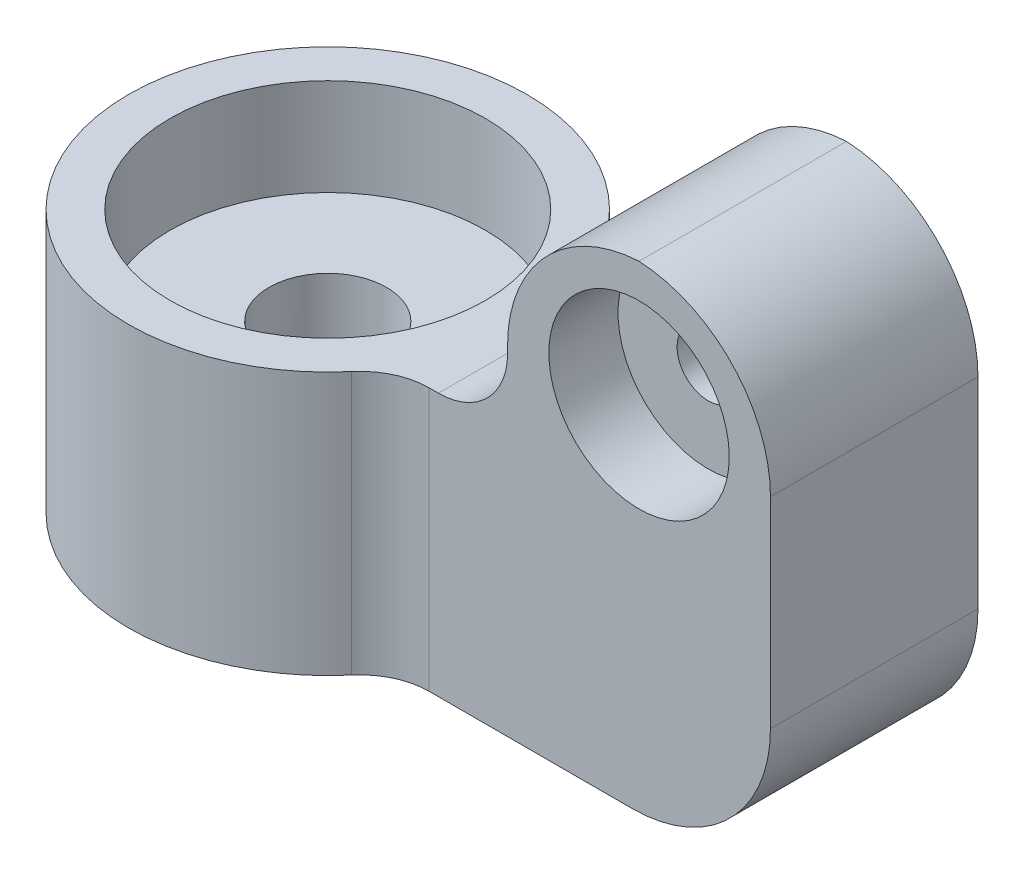
ISO-10303-21;
HEADER;
FILE_DESCRIPTION(('STEP AP214'),'2;1');
FILE_NAME('part.step','',(''),(''),'','','');
FILE_SCHEMA(('AUTOMOTIVE_DESIGN { 1 0 10303 214 1 1 1 1 }'));
ENDSEC;
DATA;
#1=APPLICATION_CONTEXT('core data for automotive mechanical design processes');
#2=APPLICATION_PROTOCOL_DEFINITION('international standard','automotive_design',2000,#1);
#3=PRODUCT_CONTEXT('',#1,'mechanical');
#4=PRODUCT('Part','Part','',(#3));
#5=PRODUCT_RELATED_PRODUCT_CATEGORY('part','',(#4));
#6=PRODUCT_DEFINITION_FORMATION('','',#4);
#7=PRODUCT_DEFINITION_CONTEXT('part definition',#1,'design');
#8=PRODUCT_DEFINITION('design','',#6,#7);
#9=PRODUCT_DEFINITION_SHAPE('','',#8);
#10=(LENGTH_UNIT() NAMED_UNIT(*) SI_UNIT(.MILLI.,.METRE.));
#11=(NAMED_UNIT(*) PLANE_ANGLE_UNIT() SI_UNIT($,.RADIAN.));
#12=(NAMED_UNIT(*) SI_UNIT($,.STERADIAN.) SOLID_ANGLE_UNIT());
#13=UNCERTAINTY_MEASURE_WITH_UNIT(LENGTH_MEASURE(1.E-05),#10,'distance_accuracy_value','');
#14=(GEOMETRIC_REPRESENTATION_CONTEXT(3) GLOBAL_UNCERTAINTY_ASSIGNED_CONTEXT((#13)) GLOBAL_UNIT_ASSIGNED_CONTEXT((#10,
#11,#12)) REPRESENTATION_CONTEXT('',''));
#15=CARTESIAN_POINT('',(0.,0.,0.));
#16=DIRECTION('',(0.,0.,1.));
#17=DIRECTION('',(1.,0.,0.));
#18=AXIS2_PLACEMENT_3D('',#15,#16,#17);
#19=CARTESIAN_POINT('',(-30.,-25.52,0.));
#20=DIRECTION('',(0.,1.,0.));
#21=DIRECTION('',(0.,0.,1.));
#22=AXIS2_PLACEMENT_3D('',#19,#20,#21);
#23=CYLINDRICAL_SURFACE('',#22,4.25);
#24=CARTESIAN_POINT('',(-30.,-13.52,0.));
#25=DIRECTION('',(0.,1.,0.));
#26=DIRECTION('',(0.,0.,1.));
#27=AXIS2_PLACEMENT_3D('',#24,#25,#26);
#28=CIRCLE('',#27,4.25);
#29=CARTESIAN_POINT('',(-30.,-13.52,4.25));
#30=VERTEX_POINT('',#29);
#31=EDGE_CURVE('E547',#30,#30,#28,.T.);
#32=ORIENTED_EDGE('',*,*,#31,.T.);
#33=EDGE_LOOP('',(#32));
#34=FACE_BOUND('',#33,.T.);
#35=CARTESIAN_POINT('',(-30.,-18.52,0.));
#36=DIRECTION('',(0.,-1.,0.));
#37=DIRECTION('',(1.,0.,0.));
#38=AXIS2_PLACEMENT_3D('',#35,#36,#37);
#39=CIRCLE('',#38,4.25);
#40=CARTESIAN_POINT('',(-25.75,-18.52,0.));
#41=VERTEX_POINT('',#40);
#42=EDGE_CURVE('E172',#41,#41,#39,.F.);
#43=ORIENTED_EDGE('',*,*,#42,.F.);
#44=EDGE_LOOP('',(#43));
#45=FACE_BOUND('',#44,.T.);
#46=ADVANCED_FACE('F45',(#34,#45),#23,.F.);
#47=CARTESIAN_POINT('',(0.,0.,7.5));
#48=DIRECTION('',(0.,0.,-1.));
#49=DIRECTION('',(-1.,0.,0.));
#50=AXIS2_PLACEMENT_3D('',#47,#48,#49);
#51=CYLINDRICAL_SURFACE('',#50,2.25);
#52=CARTESIAN_POINT('',(0.,0.,-2.5));
#53=DIRECTION('',(0.,0.,1.));
#54=DIRECTION('',(1.,0.,0.));
#55=AXIS2_PLACEMENT_3D('',#52,#53,#54);
#56=CIRCLE('',#55,2.25);
#57=CARTESIAN_POINT('',(2.25,0.,-2.5));
#58=VERTEX_POINT('',#57);
#59=EDGE_CURVE('E280',#58,#58,#56,.T.);
#60=ORIENTED_EDGE('',*,*,#59,.F.);
#61=EDGE_LOOP('',(#60));
#62=FACE_BOUND('',#61,.T.);
#63=CARTESIAN_POINT('',(0.,0.,2.5));
#64=DIRECTION('',(0.,0.,1.));
#65=DIRECTION('',(1.,0.,0.));
#66=AXIS2_PLACEMENT_3D('',#63,#64,#65);
#67=CIRCLE('',#66,2.25);
#68=CARTESIAN_POINT('',(2.25,0.,2.5));
#69=VERTEX_POINT('',#68);
#70=EDGE_CURVE('E273',#69,#69,#67,.T.);
#71=ORIENTED_EDGE('',*,*,#70,.T.);
#72=EDGE_LOOP('',(#71));
#73=FACE_BOUND('',#72,.T.);
#74=ADVANCED_FACE('F321',(#62,#73),#51,.F.);
#75=CARTESIAN_POINT('',(0.,-6.52,7.5));
#76=DIRECTION('',(0.,1.,0.));
#77=DIRECTION('',(0.,0.,1.));
#78=AXIS2_PLACEMENT_3D('',#75,#76,#77);
#79=PLANE('',#78);
#80=CARTESIAN_POINT('',(-30.,-6.52,0.));
#81=DIRECTION('',(0.,1.,0.));
#82=DIRECTION('',(0.,0.,1.));
#83=AXIS2_PLACEMENT_3D('',#80,#81,#82);
#84=CIRCLE('',#83,11.4);
#85=CARTESIAN_POINT('',(-30.,-6.52,11.4));
#86=VERTEX_POINT('',#85);
#87=EDGE_CURVE('E543',#86,#86,#84,.T.);
#88=ORIENTED_EDGE('',*,*,#87,.F.);
#89=EDGE_LOOP('',(#88));
#90=FACE_BOUND('',#89,.T.);
#91=DIRECTION('',(1.,0.,0.));
#92=VECTOR('',#91,1.);
#93=CARTESIAN_POINT('',(0.,-6.52,7.5));
#94=LINE('',#93,#92);
#95=CARTESIAN_POINT('',(-15.1638953899617,-6.52,7.5));
#96=VERTEX_POINT('',#95);
#97=CARTESIAN_POINT('',(-14.5,-6.52,7.5));
#98=VERTEX_POINT('',#97);
#99=EDGE_CURVE('E257',#96,#98,#94,.T.);
#100=ORIENTED_EDGE('',*,*,#99,.T.);
#101=DIRECTION('',(0.,0.,-1.));
#102=VECTOR('',#101,1.);
#103=CARTESIAN_POINT('',(-14.5,-6.52,-7.5));
#104=LINE('',#103,#102);
#105=CARTESIAN_POINT('',(-14.5,-6.52,-7.5));
#106=VERTEX_POINT('',#105);
#107=EDGE_CURVE('E177',#98,#106,#104,.T.);
#108=ORIENTED_EDGE('',*,*,#107,.T.);
#109=DIRECTION('',(1.,0.,0.));
#110=VECTOR('',#109,1.);
#111=CARTESIAN_POINT('',(0.,-6.52,-7.5));
#112=LINE('',#111,#110);
#113=CARTESIAN_POINT('',(-15.1638953899617,-6.52,-7.5));
#114=VERTEX_POINT('',#113);
#115=EDGE_CURVE('E144',#114,#106,#112,.T.);
#116=ORIENTED_EDGE('',*,*,#115,.F.);
#117=CARTESIAN_POINT('',(-15.1638953899617,-6.52,-12.5));
#118=DIRECTION('',(0.,1.,0.));
#119=DIRECTION('',(0.,0.,1.));
#120=AXIS2_PLACEMENT_3D('',#117,#118,#119);
#121=CIRCLE('',#120,5.);
#122=CARTESIAN_POINT('',(-18.987633691518,-6.52,-9.27835051546392));
#123=VERTEX_POINT('',#122);
#124=EDGE_CURVE('E156',#114,#123,#121,.F.);
#125=ORIENTED_EDGE('',*,*,#124,.T.);
#126=CARTESIAN_POINT('',(-30.,-6.52,0.));
#127=DIRECTION('',(0.,1.,0.));
#128=DIRECTION('',(0.,0.,1.));
#129=AXIS2_PLACEMENT_3D('',#126,#127,#128);
#130=CIRCLE('',#129,14.4);
#131=CARTESIAN_POINT('',(-18.987633691518,-6.52,9.27835051546392));
#132=VERTEX_POINT('',#131);
#133=EDGE_CURVE('E298',#123,#132,#130,.T.);
#134=ORIENTED_EDGE('',*,*,#133,.T.);
#135=CARTESIAN_POINT('',(-15.1638953899617,-6.52,12.5));
#136=DIRECTION('',(0.,1.,0.));
#137=DIRECTION('',(0.,0.,1.));
#138=AXIS2_PLACEMENT_3D('',#135,#136,#137);
#139=CIRCLE('',#138,5.);
#140=EDGE_CURVE('E195',#132,#96,#139,.F.);
#141=ORIENTED_EDGE('',*,*,#140,.T.);
#142=EDGE_LOOP('',(#100,#108,#116,#125,#134,#141));
#143=FACE_BOUND('',#142,.T.);
#144=ADVANCED_FACE('F260',(#90,#143),#79,.T.);
#145=CARTESIAN_POINT('',(0.,-25.52,7.5));
#146=DIRECTION('',(0.,-1.,0.));
#147=DIRECTION('',(1.,0.,0.));
#148=AXIS2_PLACEMENT_3D('',#145,#146,#147);
#149=PLANE('',#148);
#150=CARTESIAN_POINT('',(-30.,-25.52,0.));
#151=DIRECTION('',(0.,-1.,0.));
#152=DIRECTION('',(1.,0.,0.));
#153=AXIS2_PLACEMENT_3D('',#150,#151,#152);
#154=CIRCLE('',#153,11.4);
#155=CARTESIAN_POINT('',(-18.6,-25.52,0.));
#156=VERTEX_POINT('',#155);
#157=EDGE_CURVE('E242',#156,#156,#154,.T.);
#158=ORIENTED_EDGE('',*,*,#157,.F.);
#159=EDGE_LOOP('',(#158));
#160=FACE_BOUND('',#159,.T.);
#161=DIRECTION('',(-1.,0.,0.));
#162=VECTOR('',#161,1.);
#163=CARTESIAN_POINT('',(0.,-25.52,-7.5));
#164=LINE('',#163,#162);
#165=CARTESIAN_POINT('',(-0.499999999999996,-25.52,-7.5));
#166=VERTEX_POINT('',#165);
#167=CARTESIAN_POINT('',(-15.1638953899617,-25.52,-7.5));
#168=VERTEX_POINT('',#167);
#169=EDGE_CURVE('E130',#166,#168,#164,.T.);
#170=ORIENTED_EDGE('',*,*,#169,.F.);
#171=DIRECTION('',(0.,0.,-1.));
#172=VECTOR('',#171,1.);
#173=CARTESIAN_POINT('',(-0.499999999999996,-25.52,7.5));
#174=LINE('',#173,#172);
#175=CARTESIAN_POINT('',(-0.499999999999996,-25.52,7.5));
#176=VERTEX_POINT('',#175);
#177=EDGE_CURVE('E12',#166,#176,#174,.F.);
#178=ORIENTED_EDGE('',*,*,#177,.T.);
#179=DIRECTION('',(-1.,0.,0.));
#180=VECTOR('',#179,1.);
#181=CARTESIAN_POINT('',(0.,-25.52,7.5));
#182=LINE('',#181,#180);
#183=CARTESIAN_POINT('',(-15.1638953899617,-25.52,7.5));
#184=VERTEX_POINT('',#183);
#185=EDGE_CURVE('E235',#176,#184,#182,.T.);
#186=ORIENTED_EDGE('',*,*,#185,.T.);
#187=CARTESIAN_POINT('',(-15.1638953899617,-25.52,12.5));
#188=DIRECTION('',(0.,-1.,0.));
#189=DIRECTION('',(1.,0.,0.));
#190=AXIS2_PLACEMENT_3D('',#187,#188,#189);
#191=CIRCLE('',#190,5.);
#192=CARTESIAN_POINT('',(-18.987633691518,-25.52,9.27835051546392));
#193=VERTEX_POINT('',#192);
#194=EDGE_CURVE('E198',#184,#193,#191,.F.);
#195=ORIENTED_EDGE('',*,*,#194,.T.);
#196=CARTESIAN_POINT('',(-30.,-25.52,0.));
#197=DIRECTION('',(0.,1.,0.));
#198=DIRECTION('',(0.,0.,1.));
#199=AXIS2_PLACEMENT_3D('',#196,#197,#198);
#200=CIRCLE('',#199,14.4);
#201=CARTESIAN_POINT('',(-18.987633691518,-25.52,-9.27835051546392));
#202=VERTEX_POINT('',#201);
#203=EDGE_CURVE('E151',#202,#193,#200,.T.);
#204=ORIENTED_EDGE('',*,*,#203,.F.);
#205=CARTESIAN_POINT('',(-15.1638953899617,-25.52,-12.5));
#206=DIRECTION('',(0.,-1.,0.));
#207=DIRECTION('',(1.,0.,0.));
#208=AXIS2_PLACEMENT_3D('',#205,#206,#207);
#209=CIRCLE('',#208,5.);
#210=EDGE_CURVE('E148',#202,#168,#209,.F.);
#211=ORIENTED_EDGE('',*,*,#210,.T.);
#212=EDGE_LOOP('',(#170,#178,#186,#195,#204,#211));
#213=FACE_BOUND('',#212,.T.);
#214=ADVANCED_FACE('F149',(#160,#213),#149,.T.);
#215=CARTESIAN_POINT('',(9.5,0.,7.5));
#216=DIRECTION('',(1.,0.,0.));
#217=DIRECTION('',(0.,1.,0.));
#218=AXIS2_PLACEMENT_3D('',#215,#216,#217);
#219=PLANE('',#218);
#220=DIRECTION('',(0.,-1.,0.));
#221=VECTOR('',#220,1.);
#222=CARTESIAN_POINT('',(9.5,0.,-7.5));
#223=LINE('',#222,#221);
#224=CARTESIAN_POINT('',(9.5,-1.,-7.5));
#225=VERTEX_POINT('',#224);
#226=CARTESIAN_POINT('',(9.5,-15.52,-7.5));
#227=VERTEX_POINT('',#226);
#228=EDGE_CURVE('E143',#225,#227,#223,.T.);
#229=ORIENTED_EDGE('',*,*,#228,.F.);
#230=DIRECTION('',(0.,0.,-1.));
#231=VECTOR('',#230,1.);
#232=CARTESIAN_POINT('',(9.5,-1.,7.5));
#233=LINE('',#232,#231);
#234=CARTESIAN_POINT('',(9.5,-1.,7.5));
#235=VERTEX_POINT('',#234);
#236=EDGE_CURVE('E55',#225,#235,#233,.F.);
#237=ORIENTED_EDGE('',*,*,#236,.T.);
#238=DIRECTION('',(0.,-1.,0.));
#239=VECTOR('',#238,1.);
#240=CARTESIAN_POINT('',(9.5,0.,7.5));
#241=LINE('',#240,#239);
#242=CARTESIAN_POINT('',(9.5,-15.52,7.5));
#243=VERTEX_POINT('',#242);
#244=EDGE_CURVE('E169',#235,#243,#241,.T.);
#245=ORIENTED_EDGE('',*,*,#244,.T.);
#246=DIRECTION('',(0.,0.,-1.));
#247=VECTOR('',#246,1.);
#248=CARTESIAN_POINT('',(9.5,-15.52,7.5));
#249=LINE('',#248,#247);
#250=EDGE_CURVE('E220',#243,#227,#249,.T.);
#251=ORIENTED_EDGE('',*,*,#250,.T.);
#252=EDGE_LOOP('',(#229,#237,#245,#251));
#253=FACE_BOUND('',#252,.T.);
#254=ADVANCED_FACE('F228',(#253),#219,.T.);
#255=CARTESIAN_POINT('',(-9.5,0.,7.5));
#256=DIRECTION('',(-1.,0.,0.));
#257=DIRECTION('',(0.,0.,1.));
#258=AXIS2_PLACEMENT_3D('',#255,#256,#257);
#259=PLANE('',#258);
#260=DIRECTION('',(0.,1.,0.));
#261=VECTOR('',#260,1.);
#262=CARTESIAN_POINT('',(-9.5,0.,7.5));
#263=LINE('',#262,#261);
#264=CARTESIAN_POINT('',(-9.5,-1.52,7.5));
#265=VERTEX_POINT('',#264);
#266=CARTESIAN_POINT('',(-9.5,-1.,7.5));
#267=VERTEX_POINT('',#266);
#268=EDGE_CURVE('E161',#265,#267,#263,.T.);
#269=ORIENTED_EDGE('',*,*,#268,.T.);
#270=DIRECTION('',(0.,0.,-1.));
#271=VECTOR('',#270,1.);
#272=CARTESIAN_POINT('',(-9.5,-1.,7.5));
#273=LINE('',#272,#271);
#274=CARTESIAN_POINT('',(-9.5,-1.,-7.5));
#275=VERTEX_POINT('',#274);
#276=EDGE_CURVE('E201',#267,#275,#273,.T.);
#277=ORIENTED_EDGE('',*,*,#276,.T.);
#278=DIRECTION('',(0.,1.,0.));
#279=VECTOR('',#278,1.);
#280=CARTESIAN_POINT('',(-9.5,0.,-7.5));
#281=LINE('',#280,#279);
#282=CARTESIAN_POINT('',(-9.5,-1.52,-7.5));
#283=VERTEX_POINT('',#282);
#284=EDGE_CURVE('E251',#283,#275,#281,.T.);
#285=ORIENTED_EDGE('',*,*,#284,.F.);
#286=DIRECTION('',(0.,0.,-1.));
#287=VECTOR('',#286,1.);
#288=CARTESIAN_POINT('',(-9.5,-1.52,7.5));
#289=LINE('',#288,#287);
#290=EDGE_CURVE('E181',#283,#265,#289,.F.);
#291=ORIENTED_EDGE('',*,*,#290,.T.);
#292=EDGE_LOOP('',(#269,#277,#285,#291));
#293=FACE_BOUND('',#292,.T.);
#294=ADVANCED_FACE('F248',(#293),#259,.T.);
#295=CARTESIAN_POINT('',(0.,0.,7.5));
#296=DIRECTION('',(0.,0.,1.));
#297=DIRECTION('',(1.,0.,0.));
#298=AXIS2_PLACEMENT_3D('',#295,#296,#297);
#299=PLANE('',#298);
#300=CARTESIAN_POINT('',(-0.499999999999999,-1.,7.5));
#301=DIRECTION('',(0.,0.,1.));
#302=DIRECTION('',(1.,0.,0.));
#303=AXIS2_PLACEMENT_3D('',#300,#301,#302);
#304=CIRCLE('',#303,10.);
#305=CARTESIAN_POINT('',(0.,8.98749217771909,7.5));
#306=VERTEX_POINT('',#305);
#307=EDGE_CURVE('E62',#235,#306,#304,.T.);
#308=ORIENTED_EDGE('',*,*,#307,.T.);
#309=CARTESIAN_POINT('',(0.5,-1.,7.5));
#310=DIRECTION('',(0.,0.,1.));
#311=DIRECTION('',(1.,0.,0.));
#312=AXIS2_PLACEMENT_3D('',#309,#310,#311);
#313=CIRCLE('',#312,10.);
#314=EDGE_CURVE('E217',#306,#267,#313,.T.);
#315=ORIENTED_EDGE('',*,*,#314,.T.);
#316=ORIENTED_EDGE('',*,*,#268,.F.);
#317=CARTESIAN_POINT('',(-14.5,-1.52,7.5));
#318=DIRECTION('',(0.,0.,1.));
#319=DIRECTION('',(1.,0.,0.));
#320=AXIS2_PLACEMENT_3D('',#317,#318,#319);
#321=CIRCLE('',#320,5.);
#322=EDGE_CURVE('E192',#265,#98,#321,.F.);
#323=ORIENTED_EDGE('',*,*,#322,.T.);
#324=ORIENTED_EDGE('',*,*,#99,.F.);
#325=DIRECTION('',(0.,-1.,0.));
#326=VECTOR('',#325,1.);
#327=CARTESIAN_POINT('',(-15.1638953899617,-25.52,7.5));
#328=LINE('',#327,#326);
#329=EDGE_CURVE('E184',#96,#184,#328,.T.);
#330=ORIENTED_EDGE('',*,*,#329,.T.);
#331=ORIENTED_EDGE('',*,*,#185,.F.);
#332=CARTESIAN_POINT('',(-0.499999999999997,-15.52,7.5));
#333=DIRECTION('',(0.,0.,1.));
#334=DIRECTION('',(1.,0.,0.));
#335=AXIS2_PLACEMENT_3D('',#332,#333,#334);
#336=CIRCLE('',#335,10.);
#337=EDGE_CURVE('E68',#176,#243,#336,.T.);
#338=ORIENTED_EDGE('',*,*,#337,.T.);
#339=ORIENTED_EDGE('',*,*,#244,.F.);
#340=EDGE_LOOP('',(#308,#315,#316,#323,#324,#330,#331,#338,#339));
#341=FACE_BOUND('',#340,.T.);
#342=CARTESIAN_POINT('',(0.,0.,7.5));
#343=DIRECTION('',(0.,0.,1.));
#344=DIRECTION('',(1.,0.,0.));
#345=AXIS2_PLACEMENT_3D('',#342,#343,#344);
#346=CIRCLE('',#345,6.52);
#347=CARTESIAN_POINT('',(6.52,0.,7.5));
#348=VERTEX_POINT('',#347);
#349=EDGE_CURVE('E269',#348,#348,#346,.T.);
#350=ORIENTED_EDGE('',*,*,#349,.F.);
#351=EDGE_LOOP('',(#350));
#352=FACE_BOUND('',#351,.T.);
#353=ADVANCED_FACE('F232',(#341,#352),#299,.T.);
#354=CARTESIAN_POINT('',(0.,0.,-7.5));
#355=DIRECTION('',(0.,0.,1.));
#356=DIRECTION('',(1.,0.,0.));
#357=AXIS2_PLACEMENT_3D('',#354,#355,#356);
#358=PLANE('',#357);
#359=CARTESIAN_POINT('',(0.,0.,-7.5));
#360=DIRECTION('',(0.,0.,1.));
#361=DIRECTION('',(1.,0.,0.));
#362=AXIS2_PLACEMENT_3D('',#359,#360,#361);
#363=CIRCLE('',#362,6.52);
#364=CARTESIAN_POINT('',(6.52,0.,-7.5));
#365=VERTEX_POINT('',#364);
#366=EDGE_CURVE('E290',#365,#365,#363,.T.);
#367=ORIENTED_EDGE('',*,*,#366,.T.);
#368=EDGE_LOOP('',(#367));
#369=FACE_BOUND('',#368,.T.);
#370=ORIENTED_EDGE('',*,*,#284,.T.);
#371=CARTESIAN_POINT('',(0.5,-1.,-7.5));
#372=DIRECTION('',(0.,0.,1.));
#373=DIRECTION('',(1.,0.,0.));
#374=AXIS2_PLACEMENT_3D('',#371,#372,#373);
#375=CIRCLE('',#374,10.);
#376=CARTESIAN_POINT('',(0.,8.98749217771909,-7.5));
#377=VERTEX_POINT('',#376);
#378=EDGE_CURVE('E210',#275,#377,#375,.F.);
#379=ORIENTED_EDGE('',*,*,#378,.T.);
#380=CARTESIAN_POINT('',(-0.499999999999999,-1.,-7.5));
#381=DIRECTION('',(0.,0.,1.));
#382=DIRECTION('',(1.,0.,0.));
#383=AXIS2_PLACEMENT_3D('',#380,#381,#382);
#384=CIRCLE('',#383,10.);
#385=EDGE_CURVE('E207',#377,#225,#384,.F.);
#386=ORIENTED_EDGE('',*,*,#385,.T.);
#387=ORIENTED_EDGE('',*,*,#228,.T.);
#388=CARTESIAN_POINT('',(-0.499999999999997,-15.52,-7.5));
#389=DIRECTION('',(0.,0.,1.));
#390=DIRECTION('',(1.,0.,0.));
#391=AXIS2_PLACEMENT_3D('',#388,#389,#390);
#392=CIRCLE('',#391,10.);
#393=EDGE_CURVE('E139',#227,#166,#392,.F.);
#394=ORIENTED_EDGE('',*,*,#393,.T.);
#395=ORIENTED_EDGE('',*,*,#169,.T.);
#396=DIRECTION('',(0.,1.,0.));
#397=VECTOR('',#396,1.);
#398=CARTESIAN_POINT('',(-15.1638953899617,0.,-7.5));
#399=LINE('',#398,#397);
#400=EDGE_CURVE('E136',#168,#114,#399,.T.);
#401=ORIENTED_EDGE('',*,*,#400,.T.);
#402=ORIENTED_EDGE('',*,*,#115,.T.);
#403=CARTESIAN_POINT('',(-14.5,-1.52,-7.5));
#404=DIRECTION('',(0.,0.,1.));
#405=DIRECTION('',(1.,0.,0.));
#406=AXIS2_PLACEMENT_3D('',#403,#404,#405);
#407=CIRCLE('',#406,5.);
#408=EDGE_CURVE('E155',#106,#283,#407,.T.);
#409=ORIENTED_EDGE('',*,*,#408,.T.);
#410=EDGE_LOOP('',(#370,#379,#386,#387,#394,#395,#401,#402,#409));
#411=FACE_BOUND('',#410,.T.);
#412=ADVANCED_FACE('F133',(#369,#411),#358,.F.);
#413=CARTESIAN_POINT('',(0.,0.,2.5));
#414=DIRECTION('',(0.,0.,1.));
#415=DIRECTION('',(1.,0.,0.));
#416=AXIS2_PLACEMENT_3D('',#413,#414,#415);
#417=CYLINDRICAL_SURFACE('',#416,6.52);
#418=CARTESIAN_POINT('',(0.,0.,2.5));
#419=DIRECTION('',(0.,0.,1.));
#420=DIRECTION('',(1.,0.,0.));
#421=AXIS2_PLACEMENT_3D('',#418,#419,#420);
#422=CIRCLE('',#421,6.52);
#423=CARTESIAN_POINT('',(6.52,0.,2.5));
#424=VERTEX_POINT('',#423);
#425=EDGE_CURVE('E279',#424,#424,#422,.T.);
#426=ORIENTED_EDGE('',*,*,#425,.F.);
#427=EDGE_LOOP('',(#426));
#428=FACE_BOUND('',#427,.T.);
#429=ORIENTED_EDGE('',*,*,#349,.T.);
#430=EDGE_LOOP('',(#429));
#431=FACE_BOUND('',#430,.T.);
#432=ADVANCED_FACE('F306',(#428,#431),#417,.F.);
#433=CARTESIAN_POINT('',(0.,0.,2.5));
#434=DIRECTION('',(0.,0.,1.));
#435=DIRECTION('',(1.,0.,0.));
#436=AXIS2_PLACEMENT_3D('',#433,#434,#435);
#437=PLANE('',#436);
#438=ORIENTED_EDGE('',*,*,#70,.F.);
#439=EDGE_LOOP('',(#438));
#440=FACE_BOUND('',#439,.T.);
#441=ORIENTED_EDGE('',*,*,#425,.T.);
#442=EDGE_LOOP('',(#441));
#443=FACE_BOUND('',#442,.T.);
#444=ADVANCED_FACE('F304',(#440,#443),#437,.T.);
#445=CARTESIAN_POINT('',(0.,0.,-2.5));
#446=DIRECTION('',(0.,0.,-1.));
#447=DIRECTION('',(-1.,0.,0.));
#448=AXIS2_PLACEMENT_3D('',#445,#446,#447);
#449=CYLINDRICAL_SURFACE('',#448,6.52);
#450=CARTESIAN_POINT('',(0.,0.,-2.5));
#451=DIRECTION('',(0.,0.,1.));
#452=DIRECTION('',(1.,0.,0.));
#453=AXIS2_PLACEMENT_3D('',#450,#451,#452);
#454=CIRCLE('',#453,6.52);
#455=CARTESIAN_POINT('',(6.52,0.,-2.5));
#456=VERTEX_POINT('',#455);
#457=EDGE_CURVE('E283',#456,#456,#454,.T.);
#458=ORIENTED_EDGE('',*,*,#457,.T.);
#459=EDGE_LOOP('',(#458));
#460=FACE_BOUND('',#459,.T.);
#461=ORIENTED_EDGE('',*,*,#366,.F.);
#462=EDGE_LOOP('',(#461));
#463=FACE_BOUND('',#462,.T.);
#464=ADVANCED_FACE('F342',(#460,#463),#449,.F.);
#465=CARTESIAN_POINT('',(0.,0.,-2.5));
#466=DIRECTION('',(0.,0.,1.));
#467=DIRECTION('',(1.,0.,0.));
#468=AXIS2_PLACEMENT_3D('',#465,#466,#467);
#469=PLANE('',#468);
#470=ORIENTED_EDGE('',*,*,#59,.T.);
#471=EDGE_LOOP('',(#470));
#472=FACE_BOUND('',#471,.T.);
#473=ORIENTED_EDGE('',*,*,#457,.F.);
#474=EDGE_LOOP('',(#473));
#475=FACE_BOUND('',#474,.T.);
#476=ADVANCED_FACE('F338',(#472,#475),#469,.F.);
#477=CARTESIAN_POINT('',(-30.,-25.52,0.));
#478=DIRECTION('',(0.,1.,0.));
#479=DIRECTION('',(0.,0.,1.));
#480=AXIS2_PLACEMENT_3D('',#477,#478,#479);
#481=CYLINDRICAL_SURFACE('',#480,14.4);
#482=ORIENTED_EDGE('',*,*,#133,.F.);
#483=DIRECTION('',(0.,1.,0.));
#484=VECTOR('',#483,1.);
#485=CARTESIAN_POINT('',(-18.987633691518,-25.52,-9.27835051546392));
#486=LINE('',#485,#484);
#487=EDGE_CURVE('E166',#123,#202,#486,.F.);
#488=ORIENTED_EDGE('',*,*,#487,.T.);
#489=ORIENTED_EDGE('',*,*,#203,.T.);
#490=DIRECTION('',(0.,1.,0.));
#491=VECTOR('',#490,1.);
#492=CARTESIAN_POINT('',(-18.987633691518,-25.52,9.27835051546392));
#493=LINE('',#492,#491);
#494=EDGE_CURVE('E160',#193,#132,#493,.T.);
#495=ORIENTED_EDGE('',*,*,#494,.T.);
#496=EDGE_LOOP('',(#482,#488,#489,#495));
#497=FACE_BOUND('',#496,.T.);
#498=ADVANCED_FACE('F335',(#497),#481,.T.);
#499=CARTESIAN_POINT('',(-30.,-13.52,0.));
#500=DIRECTION('',(0.,1.,0.));
#501=DIRECTION('',(0.,0.,1.));
#502=AXIS2_PLACEMENT_3D('',#499,#500,#501);
#503=CYLINDRICAL_SURFACE('',#502,11.4);
#504=CARTESIAN_POINT('',(-30.,-13.52,0.));
#505=DIRECTION('',(0.,1.,0.));
#506=DIRECTION('',(0.,0.,1.));
#507=AXIS2_PLACEMENT_3D('',#504,#505,#506);
#508=CIRCLE('',#507,11.4);
#509=CARTESIAN_POINT('',(-30.,-13.52,11.4));
#510=VERTEX_POINT('',#509);
#511=EDGE_CURVE('E546',#510,#510,#508,.T.);
#512=ORIENTED_EDGE('',*,*,#511,.F.);
#513=EDGE_LOOP('',(#512));
#514=FACE_BOUND('',#513,.T.);
#515=ORIENTED_EDGE('',*,*,#87,.T.);
#516=EDGE_LOOP('',(#515));
#517=FACE_BOUND('',#516,.T.);
#518=ADVANCED_FACE('F333',(#514,#517),#503,.F.);
#519=CARTESIAN_POINT('',(-30.,-13.52,0.));
#520=DIRECTION('',(0.,1.,0.));
#521=DIRECTION('',(0.,0.,1.));
#522=AXIS2_PLACEMENT_3D('',#519,#520,#521);
#523=PLANE('',#522);
#524=ORIENTED_EDGE('',*,*,#31,.F.);
#525=EDGE_LOOP('',(#524));
#526=FACE_BOUND('',#525,.T.);
#527=ORIENTED_EDGE('',*,*,#511,.T.);
#528=EDGE_LOOP('',(#527));
#529=FACE_BOUND('',#528,.T.);
#530=ADVANCED_FACE('F374',(#526,#529),#523,.T.);
#531=CARTESIAN_POINT('',(-30.,-18.52,0.));
#532=DIRECTION('',(0.,-1.,0.));
#533=DIRECTION('',(1.,0.,0.));
#534=AXIS2_PLACEMENT_3D('',#531,#532,#533);
#535=PLANE('',#534);
#536=CARTESIAN_POINT('',(-30.,-18.52,0.));
#537=DIRECTION('',(0.,-1.,0.));
#538=DIRECTION('',(1.,0.,0.));
#539=AXIS2_PLACEMENT_3D('',#536,#537,#538);
#540=CIRCLE('',#539,11.4);
#541=CARTESIAN_POINT('',(-18.6,-18.52,0.));
#542=VERTEX_POINT('',#541);
#543=EDGE_CURVE('E563',#542,#542,#540,.T.);
#544=ORIENTED_EDGE('',*,*,#543,.T.);
#545=EDGE_LOOP('',(#544));
#546=FACE_BOUND('',#545,.T.);
#547=ORIENTED_EDGE('',*,*,#42,.T.);
#548=EDGE_LOOP('',(#547));
#549=FACE_BOUND('',#548,.T.);
#550=ADVANCED_FACE('F381',(#546,#549),#535,.T.);
#551=CARTESIAN_POINT('',(-30.,-18.52,0.));
#552=DIRECTION('',(0.,-1.,0.));
#553=DIRECTION('',(0.,0.,-1.));
#554=AXIS2_PLACEMENT_3D('',#551,#552,#553);
#555=CYLINDRICAL_SURFACE('',#554,11.4);
#556=ORIENTED_EDGE('',*,*,#543,.F.);
#557=EDGE_LOOP('',(#556));
#558=FACE_BOUND('',#557,.T.);
#559=ORIENTED_EDGE('',*,*,#157,.T.);
#560=EDGE_LOOP('',(#559));
#561=FACE_BOUND('',#560,.T.);
#562=ADVANCED_FACE('F388',(#558,#561),#555,.F.);
#563=CARTESIAN_POINT('',(-15.1638953899617,-25.52,-12.5));
#564=DIRECTION('',(0.,1.,0.));
#565=DIRECTION('',(0.,0.,1.));
#566=AXIS2_PLACEMENT_3D('',#563,#564,#565);
#567=CYLINDRICAL_SURFACE('',#566,5.);
#568=ORIENTED_EDGE('',*,*,#210,.F.);
#569=ORIENTED_EDGE('',*,*,#487,.F.);
#570=ORIENTED_EDGE('',*,*,#124,.F.);
#571=ORIENTED_EDGE('',*,*,#400,.F.);
#572=EDGE_LOOP('',(#568,#569,#570,#571));
#573=FACE_BOUND('',#572,.T.);
#574=ADVANCED_FACE('F158',(#573),#567,.F.);
#575=CARTESIAN_POINT('',(-14.5,-1.52,7.5));
#576=DIRECTION('',(0.,0.,1.));
#577=DIRECTION('',(1.,0.,0.));
#578=AXIS2_PLACEMENT_3D('',#575,#576,#577);
#579=CYLINDRICAL_SURFACE('',#578,5.);
#580=ORIENTED_EDGE('',*,*,#322,.F.);
#581=ORIENTED_EDGE('',*,*,#290,.F.);
#582=ORIENTED_EDGE('',*,*,#408,.F.);
#583=ORIENTED_EDGE('',*,*,#107,.F.);
#584=EDGE_LOOP('',(#580,#581,#582,#583));
#585=FACE_BOUND('',#584,.T.);
#586=ADVANCED_FACE('F253',(#585),#579,.F.);
#587=CARTESIAN_POINT('',(-15.1638953899617,-25.52,12.5));
#588=DIRECTION('',(0.,1.,0.));
#589=DIRECTION('',(0.,0.,1.));
#590=AXIS2_PLACEMENT_3D('',#587,#588,#589);
#591=CYLINDRICAL_SURFACE('',#590,5.);
#592=ORIENTED_EDGE('',*,*,#194,.F.);
#593=ORIENTED_EDGE('',*,*,#329,.F.);
#594=ORIENTED_EDGE('',*,*,#140,.F.);
#595=ORIENTED_EDGE('',*,*,#494,.F.);
#596=EDGE_LOOP('',(#592,#593,#594,#595));
#597=FACE_BOUND('',#596,.T.);
#598=ADVANCED_FACE('F408',(#597),#591,.F.);
#599=CARTESIAN_POINT('',(-0.499999999999999,-1.,7.5));
#600=DIRECTION('',(0.,0.,-1.));
#601=DIRECTION('',(-1.,0.,0.));
#602=AXIS2_PLACEMENT_3D('',#599,#600,#601);
#603=CYLINDRICAL_SURFACE('',#602,10.);
#604=DIRECTION('',(0.,0.,-1.));
#605=VECTOR('',#604,1.);
#606=CARTESIAN_POINT('',(0.,8.98749217771909,0.));
#607=LINE('',#606,#605);
#608=EDGE_CURVE('E49',#306,#377,#607,.T.);
#609=ORIENTED_EDGE('',*,*,#608,.F.);
#610=ORIENTED_EDGE('',*,*,#307,.F.);
#611=ORIENTED_EDGE('',*,*,#236,.F.);
#612=ORIENTED_EDGE('',*,*,#385,.F.);
#613=EDGE_LOOP('',(#609,#610,#611,#612));
#614=FACE_BOUND('',#613,.T.);
#615=ADVANCED_FACE('F237',(#614),#603,.T.);
#616=CARTESIAN_POINT('',(0.5,-1.,7.5));
#617=DIRECTION('',(0.,0.,-1.));
#618=DIRECTION('',(-1.,0.,0.));
#619=AXIS2_PLACEMENT_3D('',#616,#617,#618);
#620=CYLINDRICAL_SURFACE('',#619,10.);
#621=ORIENTED_EDGE('',*,*,#314,.F.);
#622=ORIENTED_EDGE('',*,*,#608,.T.);
#623=ORIENTED_EDGE('',*,*,#378,.F.);
#624=ORIENTED_EDGE('',*,*,#276,.F.);
#625=EDGE_LOOP('',(#621,#622,#623,#624));
#626=FACE_BOUND('',#625,.T.);
#627=ADVANCED_FACE('F244',(#626),#620,.T.);
#628=CARTESIAN_POINT('',(-0.499999999999997,-15.52,7.5));
#629=DIRECTION('',(0.,0.,-1.));
#630=DIRECTION('',(-1.,0.,0.));
#631=AXIS2_PLACEMENT_3D('',#628,#629,#630);
#632=CYLINDRICAL_SURFACE('',#631,10.);
#633=ORIENTED_EDGE('',*,*,#337,.F.);
#634=ORIENTED_EDGE('',*,*,#177,.F.);
#635=ORIENTED_EDGE('',*,*,#393,.F.);
#636=ORIENTED_EDGE('',*,*,#250,.F.);
#637=EDGE_LOOP('',(#633,#634,#635,#636));
#638=FACE_BOUND('',#637,.T.);
#639=ADVANCED_FACE('F47',(#638),#632,.T.);
#640=CLOSED_SHELL('',(#46,#74,#144,#214,#254,#294,#353,#412,#432,#444,#464,#476,#498,#518,#530,
#550,#562,#574,#586,#598,#615,#627,#639));
#641=MANIFOLD_SOLID_BREP('B2',#640);
#642=ADVANCED_BREP_SHAPE_REPRESENTATION('',(#18,#641),#14);
#643=SHAPE_DEFINITION_REPRESENTATION(#9,#642);
ENDSEC;
END-ISO-10303-21;
